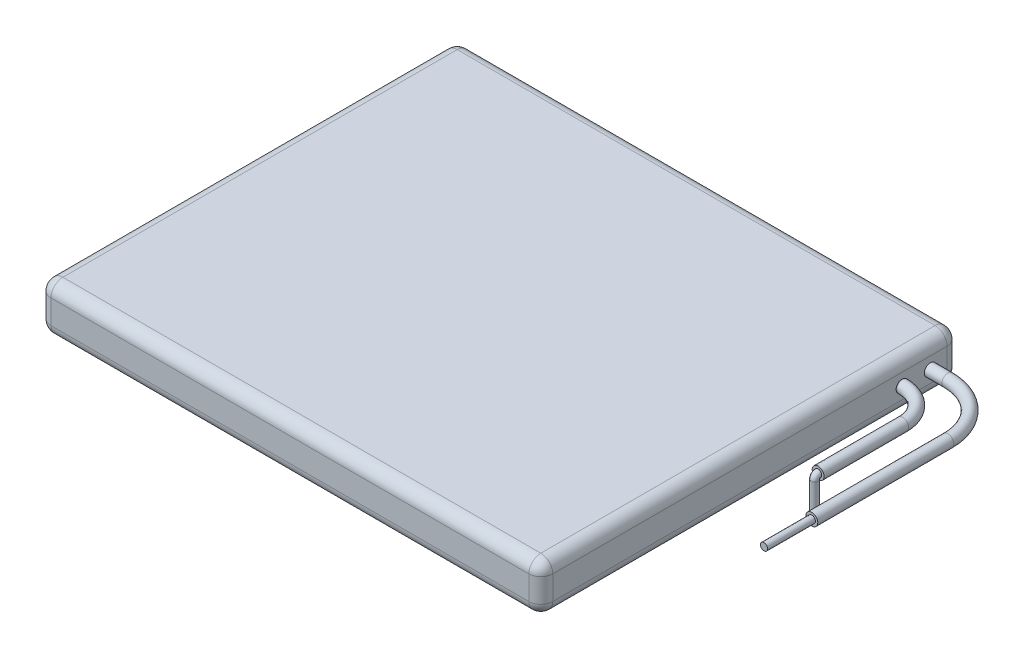
ISO-10303-21;
HEADER;
FILE_DESCRIPTION(('STEP AP214'),'2;1');
FILE_NAME('part.step','',(''),(''),'','','');
FILE_SCHEMA(('AUTOMOTIVE_DESIGN { 1 0 10303 214 1 1 1 1 }'));
ENDSEC;
DATA;
#1=APPLICATION_CONTEXT('core data for automotive mechanical design processes');
#2=APPLICATION_PROTOCOL_DEFINITION('international standard','automotive_design',2000,#1);
#3=PRODUCT_CONTEXT('',#1,'mechanical');
#4=PRODUCT('Part','Part','',(#3));
#5=PRODUCT_RELATED_PRODUCT_CATEGORY('part','',(#4));
#6=PRODUCT_DEFINITION_FORMATION('','',#4);
#7=PRODUCT_DEFINITION_CONTEXT('part definition',#1,'design');
#8=PRODUCT_DEFINITION('design','',#6,#7);
#9=PRODUCT_DEFINITION_SHAPE('','',#8);
#10=(LENGTH_UNIT() NAMED_UNIT(*) SI_UNIT(.MILLI.,.METRE.));
#11=(NAMED_UNIT(*) PLANE_ANGLE_UNIT() SI_UNIT($,.RADIAN.));
#12=(NAMED_UNIT(*) SI_UNIT($,.STERADIAN.) SOLID_ANGLE_UNIT());
#13=UNCERTAINTY_MEASURE_WITH_UNIT(LENGTH_MEASURE(1.E-05),#10,'distance_accuracy_value','');
#14=(GEOMETRIC_REPRESENTATION_CONTEXT(3) GLOBAL_UNCERTAINTY_ASSIGNED_CONTEXT((#13)) GLOBAL_UNIT_ASSIGNED_CONTEXT((#10,
#11,#12)) REPRESENTATION_CONTEXT('',''));
#15=CARTESIAN_POINT('',(0.,0.,0.));
#16=DIRECTION('',(0.,0.,1.));
#17=DIRECTION('',(1.,0.,0.));
#18=AXIS2_PLACEMENT_3D('',#15,#16,#17);
#19=CARTESIAN_POINT('',(0.,4.,0.));
#20=DIRECTION('',(-1.,0.,0.));
#21=DIRECTION('',(0.,0.,1.));
#22=AXIS2_PLACEMENT_3D('',#19,#20,#21);
#23=PLANE('',#22);
#24=DIRECTION('',(0.,-1.,0.));
#25=VECTOR('',#24,1.);
#26=CARTESIAN_POINT('',(2.42663032525213E-13,4.,-33.9999999999999));
#27=LINE('',#26,#25);
#28=CARTESIAN_POINT('',(2.42663032525213E-13,3.,-33.9999999999999));
#29=VERTEX_POINT('',#28);
#30=CARTESIAN_POINT('',(2.42663032525213E-13,1.,-33.9999999999999));
#31=VERTEX_POINT('',#30);
#32=EDGE_CURVE('E198',#29,#31,#27,.T.);
#33=ORIENTED_EDGE('',*,*,#32,.T.);
#34=DIRECTION('',(0.,0.,-1.));
#35=VECTOR('',#34,1.);
#36=CARTESIAN_POINT('',(0.,1.,0.));
#37=LINE('',#36,#35);
#38=CARTESIAN_POINT('',(0.,1.,-1.00000000000001));
#39=VERTEX_POINT('',#38);
#40=EDGE_CURVE('E217',#31,#39,#37,.F.);
#41=ORIENTED_EDGE('',*,*,#40,.T.);
#42=DIRECTION('',(0.,-1.,0.));
#43=VECTOR('',#42,1.);
#44=CARTESIAN_POINT('',(0.,4.,-1.00000000000001));
#45=LINE('',#44,#43);
#46=CARTESIAN_POINT('',(0.,3.,-1.00000000000001));
#47=VERTEX_POINT('',#46);
#48=EDGE_CURVE('E195',#39,#47,#45,.F.);
#49=ORIENTED_EDGE('',*,*,#48,.T.);
#50=DIRECTION('',(0.,0.,-1.));
#51=VECTOR('',#50,1.);
#52=CARTESIAN_POINT('',(2.42644446202256E-13,3.,-33.9999999999999));
#53=LINE('',#52,#51);
#54=EDGE_CURVE('E215',#47,#29,#53,.T.);
#55=ORIENTED_EDGE('',*,*,#54,.T.);
#56=EDGE_LOOP('',(#33,#41,#49,#55));
#57=FACE_BOUND('',#56,.T.);
#58=ADVANCED_FACE('F37',(#57),#23,.T.);
#59=CARTESIAN_POINT('',(0.,4.,0.));
#60=DIRECTION('',(0.,0.,-1.));
#61=DIRECTION('',(-1.,0.,0.));
#62=AXIS2_PLACEMENT_3D('',#59,#60,#61);
#63=PLANE('',#62);
#64=DIRECTION('',(0.,-1.,0.));
#65=VECTOR('',#64,1.);
#66=CARTESIAN_POINT('',(41.,4.,0.));
#67=LINE('',#66,#65);
#68=CARTESIAN_POINT('',(41.,1.,0.));
#69=VERTEX_POINT('',#68);
#70=CARTESIAN_POINT('',(41.,3.,0.));
#71=VERTEX_POINT('',#70);
#72=EDGE_CURVE('E186',#69,#71,#67,.F.);
#73=ORIENTED_EDGE('',*,*,#72,.T.);
#74=DIRECTION('',(1.,0.,0.));
#75=VECTOR('',#74,1.);
#76=CARTESIAN_POINT('',(0.,3.,0.));
#77=LINE('',#76,#75);
#78=CARTESIAN_POINT('',(1.00000000000001,3.,0.));
#79=VERTEX_POINT('',#78);
#80=EDGE_CURVE('E166',#71,#79,#77,.F.);
#81=ORIENTED_EDGE('',*,*,#80,.T.);
#82=DIRECTION('',(0.,-1.,0.));
#83=VECTOR('',#82,1.);
#84=CARTESIAN_POINT('',(1.00000000000001,0.,0.));
#85=LINE('',#84,#83);
#86=CARTESIAN_POINT('',(1.00000000000001,1.,0.));
#87=VERTEX_POINT('',#86);
#88=EDGE_CURVE('E183',#79,#87,#85,.T.);
#89=ORIENTED_EDGE('',*,*,#88,.T.);
#90=DIRECTION('',(1.,0.,0.));
#91=VECTOR('',#90,1.);
#92=CARTESIAN_POINT('',(41.,1.,0.));
#93=LINE('',#92,#91);
#94=EDGE_CURVE('E247',#87,#69,#93,.T.);
#95=ORIENTED_EDGE('',*,*,#94,.T.);
#96=EDGE_LOOP('',(#73,#81,#89,#95));
#97=FACE_BOUND('',#96,.T.);
#98=ADVANCED_FACE('F302',(#97),#63,.F.);
#99=CARTESIAN_POINT('',(42.,4.,0.));
#100=DIRECTION('',(-1.,0.,0.));
#101=DIRECTION('',(0.,0.,1.));
#102=AXIS2_PLACEMENT_3D('',#99,#100,#101);
#103=PLANE('',#102);
#104=CARTESIAN_POINT('',(42.,2.,-30.2378300408133));
#105=DIRECTION('',(1.,0.,0.));
#106=DIRECTION('',(0.,0.,-1.));
#107=AXIS2_PLACEMENT_3D('',#104,#105,#106);
#108=CIRCLE('',#107,0.499999999999999);
#109=CARTESIAN_POINT('',(42.,2.,-30.7378300408133));
#110=VERTEX_POINT('',#109);
#111=EDGE_CURVE('E150',#110,#110,#108,.T.);
#112=ORIENTED_EDGE('',*,*,#111,.F.);
#113=EDGE_LOOP('',(#112));
#114=FACE_BOUND('',#113,.T.);
#115=CARTESIAN_POINT('',(42.,2.,-32.5988341464532));
#116=DIRECTION('',(1.,0.,0.));
#117=DIRECTION('',(0.,0.,-1.));
#118=AXIS2_PLACEMENT_3D('',#115,#116,#117);
#119=CIRCLE('',#118,0.499999999999999);
#120=CARTESIAN_POINT('',(42.,2.,-33.0988341464532));
#121=VERTEX_POINT('',#120);
#122=EDGE_CURVE('E163',#121,#121,#119,.T.);
#123=ORIENTED_EDGE('',*,*,#122,.F.);
#124=EDGE_LOOP('',(#123));
#125=FACE_BOUND('',#124,.T.);
#126=DIRECTION('',(0.,-1.,0.));
#127=VECTOR('',#126,1.);
#128=CARTESIAN_POINT('',(42.,4.,-1.));
#129=LINE('',#128,#127);
#130=CARTESIAN_POINT('',(42.,3.,-1.));
#131=VERTEX_POINT('',#130);
#132=CARTESIAN_POINT('',(42.,1.,-1.));
#133=VERTEX_POINT('',#132);
#134=EDGE_CURVE('E179',#131,#133,#129,.T.);
#135=ORIENTED_EDGE('',*,*,#134,.T.);
#136=DIRECTION('',(0.,0.,-1.));
#137=VECTOR('',#136,1.);
#138=CARTESIAN_POINT('',(42.,1.,-34.));
#139=LINE('',#138,#137);
#140=CARTESIAN_POINT('',(42.,1.,-34.));
#141=VERTEX_POINT('',#140);
#142=EDGE_CURVE('E234',#133,#141,#139,.T.);
#143=ORIENTED_EDGE('',*,*,#142,.T.);
#144=DIRECTION('',(0.,-1.,0.));
#145=VECTOR('',#144,1.);
#146=CARTESIAN_POINT('',(42.,4.,-34.));
#147=LINE('',#146,#145);
#148=CARTESIAN_POINT('',(42.,3.,-34.));
#149=VERTEX_POINT('',#148);
#150=EDGE_CURVE('E176',#141,#149,#147,.F.);
#151=ORIENTED_EDGE('',*,*,#150,.T.);
#152=DIRECTION('',(0.,0.,-1.));
#153=VECTOR('',#152,1.);
#154=CARTESIAN_POINT('',(42.,3.,0.));
#155=LINE('',#154,#153);
#156=EDGE_CURVE('E232',#149,#131,#155,.F.);
#157=ORIENTED_EDGE('',*,*,#156,.T.);
#158=EDGE_LOOP('',(#135,#143,#151,#157));
#159=FACE_BOUND('',#158,.T.);
#160=ADVANCED_FACE('F334',(#114,#125,#159),#103,.F.);
#161=CARTESIAN_POINT('',(2.4980018054066E-13,4.,-34.9999999999999));
#162=DIRECTION('',(0.,0.,-1.));
#163=DIRECTION('',(-1.,0.,0.));
#164=AXIS2_PLACEMENT_3D('',#161,#162,#163);
#165=PLANE('',#164);
#166=DIRECTION('',(0.,-1.,0.));
#167=VECTOR('',#166,1.);
#168=CARTESIAN_POINT('',(41.,0.,-35.));
#169=LINE('',#168,#167);
#170=CARTESIAN_POINT('',(41.,3.,-35.));
#171=VERTEX_POINT('',#170);
#172=CARTESIAN_POINT('',(41.,1.,-35.));
#173=VERTEX_POINT('',#172);
#174=EDGE_CURVE('E192',#171,#173,#169,.T.);
#175=ORIENTED_EDGE('',*,*,#174,.T.);
#176=DIRECTION('',(1.,0.,0.));
#177=VECTOR('',#176,1.);
#178=CARTESIAN_POINT('',(2.4980018054066E-13,1.,-34.9999999999999));
#179=LINE('',#178,#177);
#180=CARTESIAN_POINT('',(1.00000000000024,1.,-34.9999999999999));
#181=VERTEX_POINT('',#180);
#182=EDGE_CURVE('E226',#173,#181,#179,.F.);
#183=ORIENTED_EDGE('',*,*,#182,.T.);
#184=DIRECTION('',(0.,-1.,0.));
#185=VECTOR('',#184,1.);
#186=CARTESIAN_POINT('',(1.00000000000024,4.,-34.9999999999999));
#187=LINE('',#186,#185);
#188=CARTESIAN_POINT('',(1.00000000000024,3.,-34.9999999999999));
#189=VERTEX_POINT('',#188);
#190=EDGE_CURVE('E189',#181,#189,#187,.F.);
#191=ORIENTED_EDGE('',*,*,#190,.T.);
#192=DIRECTION('',(1.,0.,0.));
#193=VECTOR('',#192,1.);
#194=CARTESIAN_POINT('',(41.,3.,-35.));
#195=LINE('',#194,#193);
#196=EDGE_CURVE('E224',#189,#171,#195,.T.);
#197=ORIENTED_EDGE('',*,*,#196,.T.);
#198=EDGE_LOOP('',(#175,#183,#191,#197));
#199=FACE_BOUND('',#198,.T.);
#200=ADVANCED_FACE('F352',(#199),#165,.T.);
#201=CARTESIAN_POINT('',(0.,4.,0.));
#202=DIRECTION('',(0.,-1.,0.));
#203=DIRECTION('',(0.,0.,-1.));
#204=AXIS2_PLACEMENT_3D('',#201,#202,#203);
#205=PLANE('',#204);
#206=DIRECTION('',(1.,0.,0.));
#207=VECTOR('',#206,1.);
#208=CARTESIAN_POINT('',(1.00000000000024,4.,-33.9999999999999));
#209=LINE('',#208,#207);
#210=CARTESIAN_POINT('',(41.,4.,-34.));
#211=VERTEX_POINT('',#210);
#212=CARTESIAN_POINT('',(1.00000000000024,4.,-33.9999999999999));
#213=VERTEX_POINT('',#212);
#214=EDGE_CURVE('E240',#211,#213,#209,.F.);
#215=ORIENTED_EDGE('',*,*,#214,.T.);
#216=DIRECTION('',(0.,0.,-1.));
#217=VECTOR('',#216,1.);
#218=CARTESIAN_POINT('',(1.00000000000001,4.,-1.));
#219=LINE('',#218,#217);
#220=CARTESIAN_POINT('',(1.00000000000001,4.,-1.));
#221=VERTEX_POINT('',#220);
#222=EDGE_CURVE('E245',#213,#221,#219,.F.);
#223=ORIENTED_EDGE('',*,*,#222,.T.);
#224=DIRECTION('',(1.,0.,0.));
#225=VECTOR('',#224,1.);
#226=CARTESIAN_POINT('',(0.,4.,-1.));
#227=LINE('',#226,#225);
#228=CARTESIAN_POINT('',(41.,4.,-1.));
#229=VERTEX_POINT('',#228);
#230=EDGE_CURVE('E62',#221,#229,#227,.T.);
#231=ORIENTED_EDGE('',*,*,#230,.T.);
#232=DIRECTION('',(0.,0.,-1.));
#233=VECTOR('',#232,1.);
#234=CARTESIAN_POINT('',(41.,4.,0.));
#235=LINE('',#234,#233);
#236=EDGE_CURVE('E242',#229,#211,#235,.T.);
#237=ORIENTED_EDGE('',*,*,#236,.T.);
#238=EDGE_LOOP('',(#215,#223,#231,#237));
#239=FACE_BOUND('',#238,.T.);
#240=ADVANCED_FACE('F701',(#239),#205,.F.);
#241=CARTESIAN_POINT('',(0.,0.,0.));
#242=DIRECTION('',(0.,-1.,0.));
#243=DIRECTION('',(0.,0.,-1.));
#244=AXIS2_PLACEMENT_3D('',#241,#242,#243);
#245=PLANE('',#244);
#246=DIRECTION('',(1.,0.,0.));
#247=VECTOR('',#246,1.);
#248=CARTESIAN_POINT('',(1.00000000000001,0.,-1.));
#249=LINE('',#248,#247);
#250=CARTESIAN_POINT('',(41.,0.,-1.));
#251=VERTEX_POINT('',#250);
#252=CARTESIAN_POINT('',(1.00000000000001,0.,-1.));
#253=VERTEX_POINT('',#252);
#254=EDGE_CURVE('E206',#251,#253,#249,.F.);
#255=ORIENTED_EDGE('',*,*,#254,.T.);
#256=DIRECTION('',(0.,0.,-1.));
#257=VECTOR('',#256,1.);
#258=CARTESIAN_POINT('',(1.,0.,0.));
#259=LINE('',#258,#257);
#260=CARTESIAN_POINT('',(1.00000000000024,0.,-33.9999999999999));
#261=VERTEX_POINT('',#260);
#262=EDGE_CURVE('E212',#253,#261,#259,.T.);
#263=ORIENTED_EDGE('',*,*,#262,.T.);
#264=DIRECTION('',(1.,0.,0.));
#265=VECTOR('',#264,1.);
#266=CARTESIAN_POINT('',(0.,0.,-33.9999999999999));
#267=LINE('',#266,#265);
#268=CARTESIAN_POINT('',(41.,0.,-34.));
#269=VERTEX_POINT('',#268);
#270=EDGE_CURVE('E210',#261,#269,#267,.T.);
#271=ORIENTED_EDGE('',*,*,#270,.T.);
#272=DIRECTION('',(0.,0.,-1.));
#273=VECTOR('',#272,1.);
#274=CARTESIAN_POINT('',(41.,0.,-1.));
#275=LINE('',#274,#273);
#276=EDGE_CURVE('E208',#269,#251,#275,.F.);
#277=ORIENTED_EDGE('',*,*,#276,.T.);
#278=EDGE_LOOP('',(#255,#263,#271,#277));
#279=FACE_BOUND('',#278,.T.);
#280=ADVANCED_FACE('F324',(#279),#245,.T.);
#281=CARTESIAN_POINT('',(41.,4.,-1.));
#282=DIRECTION('',(0.,-1.,0.));
#283=DIRECTION('',(0.,0.,-1.));
#284=AXIS2_PLACEMENT_3D('',#281,#282,#283);
#285=CYLINDRICAL_SURFACE('',#284,1.);
#286=ORIENTED_EDGE('',*,*,#72,.F.);
#287=CARTESIAN_POINT('',(41.,1.,-1.));
#288=DIRECTION('',(0.,-1.,0.));
#289=DIRECTION('',(0.,0.,-1.));
#290=AXIS2_PLACEMENT_3D('',#287,#288,#289);
#291=CIRCLE('',#290,1.);
#292=EDGE_CURVE('E238',#69,#133,#291,.F.);
#293=ORIENTED_EDGE('',*,*,#292,.T.);
#294=ORIENTED_EDGE('',*,*,#134,.F.);
#295=CARTESIAN_POINT('',(41.,3.,-1.));
#296=DIRECTION('',(0.,-1.,0.));
#297=DIRECTION('',(0.,0.,-1.));
#298=AXIS2_PLACEMENT_3D('',#295,#296,#297);
#299=CIRCLE('',#298,1.);
#300=EDGE_CURVE('E236',#131,#71,#299,.T.);
#301=ORIENTED_EDGE('',*,*,#300,.T.);
#302=EDGE_LOOP('',(#286,#293,#294,#301));
#303=FACE_BOUND('',#302,.T.);
#304=ADVANCED_FACE('F299',(#303),#285,.T.);
#305=CARTESIAN_POINT('',(41.,4.,-34.));
#306=DIRECTION('',(0.,1.,0.));
#307=DIRECTION('',(0.,0.,1.));
#308=AXIS2_PLACEMENT_3D('',#305,#306,#307);
#309=CYLINDRICAL_SURFACE('',#308,1.);
#310=ORIENTED_EDGE('',*,*,#150,.F.);
#311=CARTESIAN_POINT('',(41.,1.,-34.));
#312=DIRECTION('',(0.,1.,0.));
#313=DIRECTION('',(0.,0.,1.));
#314=AXIS2_PLACEMENT_3D('',#311,#312,#313);
#315=CIRCLE('',#314,1.);
#316=EDGE_CURVE('E230',#141,#173,#315,.T.);
#317=ORIENTED_EDGE('',*,*,#316,.T.);
#318=ORIENTED_EDGE('',*,*,#174,.F.);
#319=CARTESIAN_POINT('',(41.,3.,-34.));
#320=DIRECTION('',(0.,1.,0.));
#321=DIRECTION('',(0.,0.,1.));
#322=AXIS2_PLACEMENT_3D('',#319,#320,#321);
#323=CIRCLE('',#322,1.);
#324=EDGE_CURVE('E228',#171,#149,#323,.F.);
#325=ORIENTED_EDGE('',*,*,#324,.T.);
#326=EDGE_LOOP('',(#310,#317,#318,#325));
#327=FACE_BOUND('',#326,.T.);
#328=ADVANCED_FACE('F338',(#327),#309,.T.);
#329=CARTESIAN_POINT('',(1.00000000000024,4.,-33.9999999999999));
#330=DIRECTION('',(0.,-1.,0.));
#331=DIRECTION('',(0.,0.,-1.));
#332=AXIS2_PLACEMENT_3D('',#329,#330,#331);
#333=CYLINDRICAL_SURFACE('',#332,1.);
#334=ORIENTED_EDGE('',*,*,#190,.F.);
#335=CARTESIAN_POINT('',(1.00000000000024,1.,-33.9999999999999));
#336=DIRECTION('',(0.,-1.,0.));
#337=DIRECTION('',(0.,0.,-1.));
#338=AXIS2_PLACEMENT_3D('',#335,#336,#337);
#339=CIRCLE('',#338,1.);
#340=EDGE_CURVE('E222',#181,#31,#339,.F.);
#341=ORIENTED_EDGE('',*,*,#340,.T.);
#342=ORIENTED_EDGE('',*,*,#32,.F.);
#343=CARTESIAN_POINT('',(1.00000000000024,3.,-33.9999999999999));
#344=DIRECTION('',(0.,-1.,0.));
#345=DIRECTION('',(0.,0.,-1.));
#346=AXIS2_PLACEMENT_3D('',#343,#344,#345);
#347=CIRCLE('',#346,1.);
#348=EDGE_CURVE('E219',#29,#189,#347,.T.);
#349=ORIENTED_EDGE('',*,*,#348,.T.);
#350=EDGE_LOOP('',(#334,#341,#342,#349));
#351=FACE_BOUND('',#350,.T.);
#352=ADVANCED_FACE('F354',(#351),#333,.T.);
#353=CARTESIAN_POINT('',(1.00000000000001,4.,-1.));
#354=DIRECTION('',(0.,1.,0.));
#355=DIRECTION('',(0.,0.,1.));
#356=AXIS2_PLACEMENT_3D('',#353,#354,#355);
#357=CYLINDRICAL_SURFACE('',#356,1.);
#358=ORIENTED_EDGE('',*,*,#48,.F.);
#359=CARTESIAN_POINT('',(1.00000000000001,1.,-1.));
#360=DIRECTION('',(0.,1.,0.));
#361=DIRECTION('',(0.,0.,1.));
#362=AXIS2_PLACEMENT_3D('',#359,#360,#361);
#363=CIRCLE('',#362,1.);
#364=EDGE_CURVE('E203',#39,#87,#363,.T.);
#365=ORIENTED_EDGE('',*,*,#364,.T.);
#366=ORIENTED_EDGE('',*,*,#88,.F.);
#367=CARTESIAN_POINT('',(1.00000000000001,3.,-1.));
#368=DIRECTION('',(0.,1.,0.));
#369=DIRECTION('',(0.,0.,1.));
#370=AXIS2_PLACEMENT_3D('',#367,#368,#369);
#371=CIRCLE('',#370,1.);
#372=EDGE_CURVE('E201',#79,#47,#371,.F.);
#373=ORIENTED_EDGE('',*,*,#372,.T.);
#374=EDGE_LOOP('',(#358,#365,#366,#373));
#375=FACE_BOUND('',#374,.T.);
#376=ADVANCED_FACE('F313',(#375),#357,.T.);
#377=CARTESIAN_POINT('',(41.,1.,-34.));
#378=DIRECTION('',(0.,-1.,0.));
#379=DIRECTION('',(0.,0.,-1.));
#380=AXIS2_PLACEMENT_3D('',#377,#378,#379);
#381=SPHERICAL_SURFACE('',#380,1.);
#382=CARTESIAN_POINT('',(41.,1.,-34.));
#383=DIRECTION('',(-1.,0.,0.));
#384=DIRECTION('',(0.,0.,1.));
#385=AXIS2_PLACEMENT_3D('',#382,#383,#384);
#386=CIRCLE('',#385,1.);
#387=EDGE_CURVE('E266',#173,#269,#386,.T.);
#388=ORIENTED_EDGE('',*,*,#387,.F.);
#389=ORIENTED_EDGE('',*,*,#316,.F.);
#390=CARTESIAN_POINT('',(41.,1.,-34.));
#391=DIRECTION('',(0.,0.,1.));
#392=DIRECTION('',(1.,0.,0.));
#393=AXIS2_PLACEMENT_3D('',#390,#391,#392);
#394=CIRCLE('',#393,1.);
#395=EDGE_CURVE('E180',#269,#141,#394,.T.);
#396=ORIENTED_EDGE('',*,*,#395,.F.);
#397=EDGE_LOOP('',(#388,#389,#396));
#398=FACE_BOUND('',#397,.T.);
#399=ADVANCED_FACE('F344',(#398),#381,.T.);
#400=CARTESIAN_POINT('',(41.,1.,0.));
#401=DIRECTION('',(0.,0.,1.));
#402=DIRECTION('',(1.,0.,0.));
#403=AXIS2_PLACEMENT_3D('',#400,#401,#402);
#404=CYLINDRICAL_SURFACE('',#403,1.);
#405=ORIENTED_EDGE('',*,*,#395,.T.);
#406=ORIENTED_EDGE('',*,*,#142,.F.);
#407=CARTESIAN_POINT('',(41.,1.,-1.));
#408=DIRECTION('',(0.,0.,1.));
#409=DIRECTION('',(1.,0.,0.));
#410=AXIS2_PLACEMENT_3D('',#407,#408,#409);
#411=CIRCLE('',#410,1.);
#412=EDGE_CURVE('E263',#251,#133,#411,.T.);
#413=ORIENTED_EDGE('',*,*,#412,.F.);
#414=ORIENTED_EDGE('',*,*,#276,.F.);
#415=EDGE_LOOP('',(#405,#406,#413,#414));
#416=FACE_BOUND('',#415,.T.);
#417=ADVANCED_FACE('F330',(#416),#404,.T.);
#418=CARTESIAN_POINT('',(0.,1.,-33.9999999999999));
#419=DIRECTION('',(1.,0.,0.));
#420=DIRECTION('',(0.,0.,-1.));
#421=AXIS2_PLACEMENT_3D('',#418,#419,#420);
#422=CYLINDRICAL_SURFACE('',#421,1.);
#423=ORIENTED_EDGE('',*,*,#387,.T.);
#424=ORIENTED_EDGE('',*,*,#270,.F.);
#425=CARTESIAN_POINT('',(1.00000000000024,1.,-33.9999999999999));
#426=DIRECTION('',(-1.,0.,0.));
#427=DIRECTION('',(0.,0.,1.));
#428=AXIS2_PLACEMENT_3D('',#425,#426,#427);
#429=CIRCLE('',#428,1.);
#430=EDGE_CURVE('E260',#181,#261,#429,.T.);
#431=ORIENTED_EDGE('',*,*,#430,.F.);
#432=ORIENTED_EDGE('',*,*,#182,.F.);
#433=EDGE_LOOP('',(#423,#424,#431,#432));
#434=FACE_BOUND('',#433,.T.);
#435=ADVANCED_FACE('F348',(#434),#422,.T.);
#436=CARTESIAN_POINT('',(41.,1.,-1.));
#437=DIRECTION('',(0.,-1.,0.));
#438=DIRECTION('',(0.,0.,-1.));
#439=AXIS2_PLACEMENT_3D('',#436,#437,#438);
#440=SPHERICAL_SURFACE('',#439,1.);
#441=ORIENTED_EDGE('',*,*,#412,.T.);
#442=ORIENTED_EDGE('',*,*,#292,.F.);
#443=CARTESIAN_POINT('',(41.,1.,-1.));
#444=DIRECTION('',(-1.,0.,0.));
#445=DIRECTION('',(0.,0.,1.));
#446=AXIS2_PLACEMENT_3D('',#443,#444,#445);
#447=CIRCLE('',#446,1.);
#448=EDGE_CURVE('E257',#251,#69,#447,.T.);
#449=ORIENTED_EDGE('',*,*,#448,.F.);
#450=EDGE_LOOP('',(#441,#442,#449));
#451=FACE_BOUND('',#450,.T.);
#452=ADVANCED_FACE('F332',(#451),#440,.T.);
#453=CARTESIAN_POINT('',(1.00000000000024,1.,-33.9999999999999));
#454=DIRECTION('',(0.,-1.,0.));
#455=DIRECTION('',(0.,0.,-1.));
#456=AXIS2_PLACEMENT_3D('',#453,#454,#455);
#457=SPHERICAL_SURFACE('',#456,1.);
#458=ORIENTED_EDGE('',*,*,#340,.F.);
#459=ORIENTED_EDGE('',*,*,#430,.T.);
#460=CARTESIAN_POINT('',(1.00000000000024,1.,-33.9999999999999));
#461=DIRECTION('',(0.,0.,1.));
#462=DIRECTION('',(1.,0.,0.));
#463=AXIS2_PLACEMENT_3D('',#460,#461,#462);
#464=CIRCLE('',#463,1.);
#465=EDGE_CURVE('E255',#31,#261,#464,.T.);
#466=ORIENTED_EDGE('',*,*,#465,.F.);
#467=EDGE_LOOP('',(#458,#459,#466));
#468=FACE_BOUND('',#467,.T.);
#469=ADVANCED_FACE('F404',(#468),#457,.T.);
#470=CARTESIAN_POINT('',(0.,1.,-1.));
#471=DIRECTION('',(-1.,0.,0.));
#472=DIRECTION('',(0.,0.,1.));
#473=AXIS2_PLACEMENT_3D('',#470,#471,#472);
#474=CYLINDRICAL_SURFACE('',#473,1.);
#475=ORIENTED_EDGE('',*,*,#448,.T.);
#476=ORIENTED_EDGE('',*,*,#94,.F.);
#477=CARTESIAN_POINT('',(1.00000000000001,1.,-1.));
#478=DIRECTION('',(-1.,0.,0.));
#479=DIRECTION('',(0.,0.,1.));
#480=AXIS2_PLACEMENT_3D('',#477,#478,#479);
#481=CIRCLE('',#480,1.);
#482=EDGE_CURVE('E253',#253,#87,#481,.T.);
#483=ORIENTED_EDGE('',*,*,#482,.F.);
#484=ORIENTED_EDGE('',*,*,#254,.F.);
#485=EDGE_LOOP('',(#475,#476,#483,#484));
#486=FACE_BOUND('',#485,.T.);
#487=ADVANCED_FACE('F307',(#486),#474,.T.);
#488=CARTESIAN_POINT('',(1.,1.,0.));
#489=DIRECTION('',(0.,0.,-1.));
#490=DIRECTION('',(-1.,0.,0.));
#491=AXIS2_PLACEMENT_3D('',#488,#489,#490);
#492=CYLINDRICAL_SURFACE('',#491,1.);
#493=ORIENTED_EDGE('',*,*,#465,.T.);
#494=ORIENTED_EDGE('',*,*,#262,.F.);
#495=CARTESIAN_POINT('',(1.00000000000001,1.,-1.));
#496=DIRECTION('',(0.,0.,1.));
#497=DIRECTION('',(1.,0.,0.));
#498=AXIS2_PLACEMENT_3D('',#495,#496,#497);
#499=CIRCLE('',#498,1.);
#500=EDGE_CURVE('E250',#39,#253,#499,.T.);
#501=ORIENTED_EDGE('',*,*,#500,.F.);
#502=ORIENTED_EDGE('',*,*,#40,.F.);
#503=EDGE_LOOP('',(#493,#494,#501,#502));
#504=FACE_BOUND('',#503,.T.);
#505=ADVANCED_FACE('F321',(#504),#492,.T.);
#506=CARTESIAN_POINT('',(1.00000000000001,1.,-1.));
#507=DIRECTION('',(0.,-1.,0.));
#508=DIRECTION('',(0.,0.,-1.));
#509=AXIS2_PLACEMENT_3D('',#506,#507,#508);
#510=SPHERICAL_SURFACE('',#509,1.);
#511=ORIENTED_EDGE('',*,*,#482,.T.);
#512=ORIENTED_EDGE('',*,*,#364,.F.);
#513=ORIENTED_EDGE('',*,*,#500,.T.);
#514=EDGE_LOOP('',(#511,#512,#513));
#515=FACE_BOUND('',#514,.T.);
#516=ADVANCED_FACE('F317',(#515),#510,.T.);
#517=CARTESIAN_POINT('',(41.,3.,-1.));
#518=DIRECTION('',(0.,-1.,0.));
#519=DIRECTION('',(0.,0.,-1.));
#520=AXIS2_PLACEMENT_3D('',#517,#518,#519);
#521=SPHERICAL_SURFACE('',#520,1.);
#522=CARTESIAN_POINT('',(41.,3.,-1.));
#523=DIRECTION('',(-1.,0.,0.));
#524=DIRECTION('',(0.,0.,1.));
#525=AXIS2_PLACEMENT_3D('',#522,#523,#524);
#526=CIRCLE('',#525,1.);
#527=EDGE_CURVE('E283',#71,#229,#526,.T.);
#528=ORIENTED_EDGE('',*,*,#527,.F.);
#529=ORIENTED_EDGE('',*,*,#300,.F.);
#530=CARTESIAN_POINT('',(41.,3.,-1.));
#531=DIRECTION('',(0.,0.,-1.));
#532=DIRECTION('',(-1.,0.,0.));
#533=AXIS2_PLACEMENT_3D('',#530,#531,#532);
#534=CIRCLE('',#533,1.);
#535=EDGE_CURVE('E41',#229,#131,#534,.T.);
#536=ORIENTED_EDGE('',*,*,#535,.F.);
#537=EDGE_LOOP('',(#528,#529,#536));
#538=FACE_BOUND('',#537,.T.);
#539=ADVANCED_FACE('F39',(#538),#521,.T.);
#540=CARTESIAN_POINT('',(41.,3.,0.));
#541=DIRECTION('',(0.,0.,-1.));
#542=DIRECTION('',(-1.,0.,0.));
#543=AXIS2_PLACEMENT_3D('',#540,#541,#542);
#544=CYLINDRICAL_SURFACE('',#543,1.);
#545=ORIENTED_EDGE('',*,*,#535,.T.);
#546=ORIENTED_EDGE('',*,*,#156,.F.);
#547=CARTESIAN_POINT('',(41.,3.,-34.));
#548=DIRECTION('',(0.,0.,-1.));
#549=DIRECTION('',(-1.,0.,0.));
#550=AXIS2_PLACEMENT_3D('',#547,#548,#549);
#551=CIRCLE('',#550,1.);
#552=EDGE_CURVE('E281',#211,#149,#551,.T.);
#553=ORIENTED_EDGE('',*,*,#552,.F.);
#554=ORIENTED_EDGE('',*,*,#236,.F.);
#555=EDGE_LOOP('',(#545,#546,#553,#554));
#556=FACE_BOUND('',#555,.T.);
#557=ADVANCED_FACE('F292',(#556),#544,.T.);
#558=CARTESIAN_POINT('',(0.,3.,-1.));
#559=DIRECTION('',(1.,0.,0.));
#560=DIRECTION('',(0.,0.,-1.));
#561=AXIS2_PLACEMENT_3D('',#558,#559,#560);
#562=CYLINDRICAL_SURFACE('',#561,1.);
#563=ORIENTED_EDGE('',*,*,#527,.T.);
#564=ORIENTED_EDGE('',*,*,#230,.F.);
#565=CARTESIAN_POINT('',(1.00000000000001,3.,-1.));
#566=DIRECTION('',(-1.,0.,0.));
#567=DIRECTION('',(0.,0.,1.));
#568=AXIS2_PLACEMENT_3D('',#565,#566,#567);
#569=CIRCLE('',#568,1.);
#570=EDGE_CURVE('E279',#79,#221,#569,.T.);
#571=ORIENTED_EDGE('',*,*,#570,.F.);
#572=ORIENTED_EDGE('',*,*,#80,.F.);
#573=EDGE_LOOP('',(#563,#564,#571,#572));
#574=FACE_BOUND('',#573,.T.);
#575=ADVANCED_FACE('F371',(#574),#562,.T.);
#576=CARTESIAN_POINT('',(41.,3.,-34.));
#577=DIRECTION('',(0.,-1.,0.));
#578=DIRECTION('',(0.,0.,-1.));
#579=AXIS2_PLACEMENT_3D('',#576,#577,#578);
#580=SPHERICAL_SURFACE('',#579,1.);
#581=ORIENTED_EDGE('',*,*,#552,.T.);
#582=ORIENTED_EDGE('',*,*,#324,.F.);
#583=CARTESIAN_POINT('',(41.,3.,-34.));
#584=DIRECTION('',(-1.,0.,0.));
#585=DIRECTION('',(0.,0.,1.));
#586=AXIS2_PLACEMENT_3D('',#583,#584,#585);
#587=CIRCLE('',#586,1.);
#588=EDGE_CURVE('E276',#211,#171,#587,.T.);
#589=ORIENTED_EDGE('',*,*,#588,.F.);
#590=EDGE_LOOP('',(#581,#582,#589));
#591=FACE_BOUND('',#590,.T.);
#592=ADVANCED_FACE('F368',(#591),#580,.T.);
#593=CARTESIAN_POINT('',(1.00000000000001,3.,-1.));
#594=DIRECTION('',(0.,-1.,0.));
#595=DIRECTION('',(0.,0.,-1.));
#596=AXIS2_PLACEMENT_3D('',#593,#594,#595);
#597=SPHERICAL_SURFACE('',#596,1.);
#598=ORIENTED_EDGE('',*,*,#372,.F.);
#599=ORIENTED_EDGE('',*,*,#570,.T.);
#600=CARTESIAN_POINT('',(1.00000000000001,3.,-1.));
#601=DIRECTION('',(0.,0.,-1.));
#602=DIRECTION('',(-1.,0.,0.));
#603=AXIS2_PLACEMENT_3D('',#600,#601,#602);
#604=CIRCLE('',#603,1.);
#605=EDGE_CURVE('E54',#47,#221,#604,.T.);
#606=ORIENTED_EDGE('',*,*,#605,.F.);
#607=EDGE_LOOP('',(#598,#599,#606));
#608=FACE_BOUND('',#607,.T.);
#609=ADVANCED_FACE('F370',(#608),#597,.T.);
#610=CARTESIAN_POINT('',(2.51782721656062E-13,3.,-33.9999999999999));
#611=DIRECTION('',(-1.,0.,0.));
#612=DIRECTION('',(0.,0.,1.));
#613=AXIS2_PLACEMENT_3D('',#610,#611,#612);
#614=CYLINDRICAL_SURFACE('',#613,1.);
#615=ORIENTED_EDGE('',*,*,#588,.T.);
#616=ORIENTED_EDGE('',*,*,#196,.F.);
#617=CARTESIAN_POINT('',(1.00000000000024,3.,-33.9999999999999));
#618=DIRECTION('',(-1.,0.,0.));
#619=DIRECTION('',(0.,0.,1.));
#620=AXIS2_PLACEMENT_3D('',#617,#618,#619);
#621=CIRCLE('',#620,1.);
#622=EDGE_CURVE('E273',#213,#189,#621,.T.);
#623=ORIENTED_EDGE('',*,*,#622,.F.);
#624=ORIENTED_EDGE('',*,*,#214,.F.);
#625=EDGE_LOOP('',(#615,#616,#623,#624));
#626=FACE_BOUND('',#625,.T.);
#627=ADVANCED_FACE('F365',(#626),#614,.T.);
#628=CARTESIAN_POINT('',(1.,3.,0.));
#629=DIRECTION('',(0.,0.,1.));
#630=DIRECTION('',(1.,0.,0.));
#631=AXIS2_PLACEMENT_3D('',#628,#629,#630);
#632=CYLINDRICAL_SURFACE('',#631,1.);
#633=ORIENTED_EDGE('',*,*,#605,.T.);
#634=ORIENTED_EDGE('',*,*,#222,.F.);
#635=CARTESIAN_POINT('',(1.00000000000024,3.,-33.9999999999999));
#636=DIRECTION('',(0.,0.,-1.));
#637=DIRECTION('',(-1.,0.,0.));
#638=AXIS2_PLACEMENT_3D('',#635,#636,#637);
#639=CIRCLE('',#638,1.);
#640=EDGE_CURVE('E175',#29,#213,#639,.T.);
#641=ORIENTED_EDGE('',*,*,#640,.F.);
#642=ORIENTED_EDGE('',*,*,#54,.F.);
#643=EDGE_LOOP('',(#633,#634,#641,#642));
#644=FACE_BOUND('',#643,.T.);
#645=ADVANCED_FACE('F362',(#644),#632,.T.);
#646=CARTESIAN_POINT('',(1.00000000000024,3.,-33.9999999999999));
#647=DIRECTION('',(0.,-1.,0.));
#648=DIRECTION('',(0.,0.,-1.));
#649=AXIS2_PLACEMENT_3D('',#646,#647,#648);
#650=SPHERICAL_SURFACE('',#649,1.);
#651=ORIENTED_EDGE('',*,*,#622,.T.);
#652=ORIENTED_EDGE('',*,*,#348,.F.);
#653=ORIENTED_EDGE('',*,*,#640,.T.);
#654=EDGE_LOOP('',(#651,#652,#653));
#655=FACE_BOUND('',#654,.T.);
#656=ADVANCED_FACE('F359',(#655),#650,.T.);
#657=CARTESIAN_POINT('',(47.8742166026691,2.,-16.8057373512895));
#658=DIRECTION('',(0.,0.,1.));
#659=DIRECTION('',(1.,0.,0.));
#660=AXIS2_PLACEMENT_3D('',#657,#658,#659);
#661=PLANE('',#660);
#662=CARTESIAN_POINT('',(47.8742166026691,2.,-16.8057373512894));
#663=DIRECTION('',(0.,0.,1.));
#664=DIRECTION('',(1.,0.,0.));
#665=AXIS2_PLACEMENT_3D('',#662,#663,#664);
#666=CIRCLE('',#665,0.300000000000003);
#667=CARTESIAN_POINT('',(48.1742166026691,2.,-16.8057373512894));
#668=VERTEX_POINT('',#667);
#669=EDGE_CURVE('E11',#668,#668,#666,.T.);
#670=ORIENTED_EDGE('',*,*,#669,.F.);
#671=EDGE_LOOP('',(#670));
#672=FACE_BOUND('',#671,.T.);
#673=CARTESIAN_POINT('',(47.8742166026691,2.,-16.8057373512895));
#674=DIRECTION('',(0.,0.,1.));
#675=DIRECTION('',(1.,0.,0.));
#676=AXIS2_PLACEMENT_3D('',#673,#674,#675);
#677=CIRCLE('',#676,0.499999999999999);
#678=CARTESIAN_POINT('',(48.3742166026691,2.,-16.8057373512895));
#679=VERTEX_POINT('',#678);
#680=EDGE_CURVE('E172',#679,#679,#677,.T.);
#681=ORIENTED_EDGE('',*,*,#680,.T.);
#682=EDGE_LOOP('',(#681));
#683=FACE_BOUND('',#682,.T.);
#684=ADVANCED_FACE('F418',(#672,#683),#661,.T.);
#685=CARTESIAN_POINT('',(42.,2.,-32.5988341464532));
#686=DIRECTION('',(1.,0.,0.));
#687=DIRECTION('',(0.,0.,-1.));
#688=AXIS2_PLACEMENT_3D('',#685,#686,#687);
#689=CYLINDRICAL_SURFACE('',#688,0.499999999999999);
#690=CARTESIAN_POINT('',(43.4720110266329,2.,-32.5988341464532));
#691=DIRECTION('',(1.,0.,0.));
#692=DIRECTION('',(0.,0.,-1.));
#693=AXIS2_PLACEMENT_3D('',#690,#691,#692);
#694=CIRCLE('',#693,0.499999999999999);
#695=CARTESIAN_POINT('',(43.4720110266329,2.,-33.0988341464532));
#696=VERTEX_POINT('',#695);
#697=EDGE_CURVE('E162',#696,#696,#694,.T.);
#698=ORIENTED_EDGE('',*,*,#697,.F.);
#699=EDGE_LOOP('',(#698));
#700=FACE_BOUND('',#699,.T.);
#701=ORIENTED_EDGE('',*,*,#122,.T.);
#702=EDGE_LOOP('',(#701));
#703=FACE_BOUND('',#702,.T.);
#704=ADVANCED_FACE('F442',(#700,#703),#689,.T.);
#705=CARTESIAN_POINT('',(43.4720110266329,2.,-28.196628570417));
#706=DIRECTION('',(0.,-1.,0.));
#707=DIRECTION('',(0.,0.,-1.));
#708=AXIS2_PLACEMENT_3D('',#705,#706,#707);
#709=TOROIDAL_SURFACE('',#708,4.4022055760362,0.499999999999999);
#710=CARTESIAN_POINT('',(47.8742166026691,2.,-28.196628570417));
#711=DIRECTION('',(0.,0.,1.));
#712=DIRECTION('',(1.,0.,0.));
#713=AXIS2_PLACEMENT_3D('',#710,#711,#712);
#714=CIRCLE('',#713,0.499999999999999);
#715=CARTESIAN_POINT('',(48.3742166026691,2.,-28.196628570417));
#716=VERTEX_POINT('',#715);
#717=EDGE_CURVE('E169',#716,#716,#714,.T.);
#718=CARTESIAN_POINT('',(43.4720110266329,2.,-28.196628570417));
#719=DIRECTION('',(0.,-1.,0.));
#720=DIRECTION('',(0.,0.,-1.));
#721=AXIS2_PLACEMENT_3D('',#718,#719,#720);
#722=CIRCLE('',#721,4.9022055760362);
#723=EDGE_CURVE('',#696,#716,#722,.T.);
#724=ORIENTED_EDGE('',*,*,#697,.T.);
#725=ORIENTED_EDGE('',*,*,#717,.F.);
#726=ORIENTED_EDGE('',*,*,#723,.T.);
#727=ORIENTED_EDGE('',*,*,#723,.F.);
#728=EDGE_LOOP('',(#724,#726,#725,#727));
#729=FACE_BOUND('',#728,.T.);
#730=ADVANCED_FACE('F452',(#729),#709,.T.);
#731=CARTESIAN_POINT('',(47.8742166026691,2.,-28.196628570417));
#732=DIRECTION('',(0.,0.,1.));
#733=DIRECTION('',(1.,0.,0.));
#734=AXIS2_PLACEMENT_3D('',#731,#732,#733);
#735=CYLINDRICAL_SURFACE('',#734,0.499999999999999);
#736=ORIENTED_EDGE('',*,*,#680,.F.);
#737=EDGE_LOOP('',(#736));
#738=FACE_BOUND('',#737,.T.);
#739=ORIENTED_EDGE('',*,*,#717,.T.);
#740=EDGE_LOOP('',(#739));
#741=FACE_BOUND('',#740,.T.);
#742=ADVANCED_FACE('F419',(#738,#741),#735,.T.);
#743=CARTESIAN_POINT('',(44.794982778538,2.,-20.4154677161522));
#744=DIRECTION('',(0.,0.,1.));
#745=DIRECTION('',(1.,0.,0.));
#746=AXIS2_PLACEMENT_3D('',#743,#744,#745);
#747=PLANE('',#746);
#748=CARTESIAN_POINT('',(44.794982778538,2.,-20.4154677161521));
#749=DIRECTION('',(0.,0.,1.));
#750=DIRECTION('',(1.,0.,0.));
#751=AXIS2_PLACEMENT_3D('',#748,#749,#750);
#752=CIRCLE('',#751,0.300000000000003);
#753=CARTESIAN_POINT('',(45.094982778538,2.,-20.4154677161521));
#754=VERTEX_POINT('',#753);
#755=EDGE_CURVE('E46',#754,#754,#752,.T.);
#756=ORIENTED_EDGE('',*,*,#755,.F.);
#757=EDGE_LOOP('',(#756));
#758=FACE_BOUND('',#757,.T.);
#759=CARTESIAN_POINT('',(44.794982778538,2.,-20.4154677161522));
#760=DIRECTION('',(0.,0.,1.));
#761=DIRECTION('',(1.,0.,0.));
#762=AXIS2_PLACEMENT_3D('',#759,#760,#761);
#763=CIRCLE('',#762,0.499999999999999);
#764=CARTESIAN_POINT('',(45.294982778538,2.,-20.4154677161522));
#765=VERTEX_POINT('',#764);
#766=EDGE_CURVE('E159',#765,#765,#763,.T.);
#767=ORIENTED_EDGE('',*,*,#766,.T.);
#768=EDGE_LOOP('',(#767));
#769=FACE_BOUND('',#768,.T.);
#770=ADVANCED_FACE('F466',(#758,#769),#747,.T.);
#771=CARTESIAN_POINT('',(42.,2.,-30.2378300408133));
#772=DIRECTION('',(1.,0.,0.));
#773=DIRECTION('',(0.,0.,-1.));
#774=AXIS2_PLACEMENT_3D('',#771,#772,#773);
#775=CYLINDRICAL_SURFACE('',#774,0.499999999999999);
#776=CARTESIAN_POINT('',(42.0539677578776,2.,-30.2378300408133));
#777=DIRECTION('',(1.,0.,0.));
#778=DIRECTION('',(0.,0.,-1.));
#779=AXIS2_PLACEMENT_3D('',#776,#777,#778);
#780=CIRCLE('',#779,0.499999999999999);
#781=CARTESIAN_POINT('',(42.0539677578776,2.,-30.7378300408133));
#782=VERTEX_POINT('',#781);
#783=EDGE_CURVE('E153',#782,#782,#780,.T.);
#784=ORIENTED_EDGE('',*,*,#783,.F.);
#785=EDGE_LOOP('',(#784));
#786=FACE_BOUND('',#785,.T.);
#787=ORIENTED_EDGE('',*,*,#111,.T.);
#788=EDGE_LOOP('',(#787));
#789=FACE_BOUND('',#788,.T.);
#790=ADVANCED_FACE('F475',(#786,#789),#775,.T.);
#791=CARTESIAN_POINT('',(42.0539677578776,2.,-27.4968150201529));
#792=DIRECTION('',(0.,-1.,0.));
#793=DIRECTION('',(0.,0.,-1.));
#794=AXIS2_PLACEMENT_3D('',#791,#792,#793);
#795=TOROIDAL_SURFACE('',#794,2.74101502066043,0.499999999999999);
#796=CARTESIAN_POINT('',(44.794982778538,2.,-27.4968150201529));
#797=DIRECTION('',(0.,0.,1.));
#798=DIRECTION('',(1.,0.,0.));
#799=AXIS2_PLACEMENT_3D('',#796,#797,#798);
#800=CIRCLE('',#799,0.499999999999999);
#801=CARTESIAN_POINT('',(45.294982778538,2.,-27.4968150201529));
#802=VERTEX_POINT('',#801);
#803=EDGE_CURVE('E156',#802,#802,#800,.T.);
#804=CARTESIAN_POINT('',(42.0539677578776,2.,-27.4968150201529));
#805=DIRECTION('',(0.,-1.,0.));
#806=DIRECTION('',(0.,0.,-1.));
#807=AXIS2_PLACEMENT_3D('',#804,#805,#806);
#808=CIRCLE('',#807,3.24101502066043);
#809=EDGE_CURVE('',#782,#802,#808,.T.);
#810=ORIENTED_EDGE('',*,*,#783,.T.);
#811=ORIENTED_EDGE('',*,*,#803,.F.);
#812=ORIENTED_EDGE('',*,*,#809,.T.);
#813=ORIENTED_EDGE('',*,*,#809,.F.);
#814=EDGE_LOOP('',(#810,#812,#811,#813));
#815=FACE_BOUND('',#814,.T.);
#816=ADVANCED_FACE('F485',(#815),#795,.T.);
#817=CARTESIAN_POINT('',(44.794982778538,2.,-27.4968150201529));
#818=DIRECTION('',(0.,0.,1.));
#819=DIRECTION('',(1.,0.,0.));
#820=AXIS2_PLACEMENT_3D('',#817,#818,#819);
#821=CYLINDRICAL_SURFACE('',#820,0.499999999999999);
#822=ORIENTED_EDGE('',*,*,#766,.F.);
#823=EDGE_LOOP('',(#822));
#824=FACE_BOUND('',#823,.T.);
#825=ORIENTED_EDGE('',*,*,#803,.T.);
#826=EDGE_LOOP('',(#825));
#827=FACE_BOUND('',#826,.T.);
#828=ADVANCED_FACE('F445',(#824,#827),#821,.T.);
#829=CARTESIAN_POINT('',(44.794982778538,-1.34465824002152,-20.1130758662213));
#830=DIRECTION('',(0.,-1.,0.));
#831=DIRECTION('',(1.,0.,0.));
#832=AXIS2_PLACEMENT_3D('',#829,#830,#831);
#833=PLANE('',#832);
#834=CARTESIAN_POINT('',(44.794982778538,-1.34465824002152,-20.1130758662213));
#835=DIRECTION('',(0.,-1.,0.));
#836=DIRECTION('',(1.,0.,0.));
#837=AXIS2_PLACEMENT_3D('',#834,#835,#836);
#838=CIRCLE('',#837,0.300000000000003);
#839=CARTESIAN_POINT('',(45.094982778538,-1.34465824002152,-20.1130758662213));
#840=VERTEX_POINT('',#839);
#841=EDGE_CURVE('E142',#840,#840,#838,.T.);
#842=ORIENTED_EDGE('',*,*,#841,.T.);
#843=EDGE_LOOP('',(#842));
#844=FACE_BOUND('',#843,.T.);
#845=ADVANCED_FACE('F501',(#844),#833,.T.);
#846=CARTESIAN_POINT('',(44.794982778538,2.,-20.4154677161521));
#847=DIRECTION('',(0.,0.,1.));
#848=DIRECTION('',(1.,0.,0.));
#849=AXIS2_PLACEMENT_3D('',#846,#847,#848);
#850=CYLINDRICAL_SURFACE('',#849,0.300000000000003);
#851=CARTESIAN_POINT('',(44.794982778538,2.,-20.4130758662213));
#852=DIRECTION('',(0.,0.,1.));
#853=DIRECTION('',(1.,0.,0.));
#854=AXIS2_PLACEMENT_3D('',#851,#852,#853);
#855=CIRCLE('',#854,0.300000000000003);
#856=CARTESIAN_POINT('',(44.794982778538,1.7,-20.4130758662213));
#857=VERTEX_POINT('',#856);
#858=EDGE_CURVE('E133',#857,#857,#855,.T.);
#859=ORIENTED_EDGE('',*,*,#858,.F.);
#860=EDGE_LOOP('',(#859));
#861=FACE_BOUND('',#860,.T.);
#862=ORIENTED_EDGE('',*,*,#755,.T.);
#863=EDGE_LOOP('',(#862));
#864=FACE_BOUND('',#863,.T.);
#865=ADVANCED_FACE('F134',(#861,#864),#850,.T.);
#866=CARTESIAN_POINT('',(44.794982778538,1.7,-20.7130758662213));
#867=DIRECTION('',(0.,-1.,0.));
#868=DIRECTION('',(0.,0.,-1.));
#869=AXIS2_PLACEMENT_3D('',#866,#867,#868);
#870=CIRCLE('',#869,0.300000000000003);
#871=TRIMMED_CURVE('',#870,(PARAMETER_VALUE(-3.14159251947934)),
(PARAMETER_VALUE(3.14159251947934)),.T.,.PARAMETER.);
#872=CARTESIAN_POINT('',(44.794982778538,1.7,-20.4130758662213));
#873=DIRECTION('',(1.,0.,0.));
#874=AXIS1_PLACEMENT('',#872,#873);
#875=SURFACE_OF_REVOLUTION('',#871,#874);
#876=CARTESIAN_POINT('',(44.794982778538,1.7,-20.1130758662213));
#877=DIRECTION('',(0.,-1.,0.));
#878=DIRECTION('',(1.,0.,0.));
#879=AXIS2_PLACEMENT_3D('',#876,#877,#878);
#880=CIRCLE('',#879,0.300000000000003);
#881=EDGE_CURVE('E139',#857,#857,#880,.T.);
#882=ORIENTED_EDGE('',*,*,#881,.F.);
#883=ORIENTED_EDGE('',*,*,#858,.T.);
#884=EDGE_LOOP('',(#882,#883));
#885=FACE_BOUND('',#884,.T.);
#886=ADVANCED_FACE('F515',(#885),#875,.T.);
#887=CARTESIAN_POINT('',(44.794982778538,1.7,-20.1130758662213));
#888=DIRECTION('',(0.,-1.,0.));
#889=DIRECTION('',(0.,0.,-1.));
#890=AXIS2_PLACEMENT_3D('',#887,#888,#889);
#891=CYLINDRICAL_SURFACE('',#890,0.300000000000003);
#892=ORIENTED_EDGE('',*,*,#841,.F.);
#893=EDGE_LOOP('',(#892));
#894=FACE_BOUND('',#893,.T.);
#895=ORIENTED_EDGE('',*,*,#881,.T.);
#896=EDGE_LOOP('',(#895));
#897=FACE_BOUND('',#896,.T.);
#898=ADVANCED_FACE('F478',(#894,#897),#891,.T.);
#899=CARTESIAN_POINT('',(47.8742166026691,2.,-12.8057373512894));
#900=DIRECTION('',(0.,0.,-1.));
#901=DIRECTION('',(-1.,0.,0.));
#902=AXIS2_PLACEMENT_3D('',#899,#900,#901);
#903=CYLINDRICAL_SURFACE('',#902,0.300000000000003);
#904=CARTESIAN_POINT('',(47.8742166026691,2.,-12.8057373512894));
#905=DIRECTION('',(0.,0.,1.));
#906=DIRECTION('',(1.,0.,0.));
#907=AXIS2_PLACEMENT_3D('',#904,#905,#906);
#908=CIRCLE('',#907,0.300000000000003);
#909=CARTESIAN_POINT('',(48.1742166026691,2.,-12.8057373512894));
#910=VERTEX_POINT('',#909);
#911=EDGE_CURVE('E140',#910,#910,#908,.T.);
#912=ORIENTED_EDGE('',*,*,#911,.F.);
#913=EDGE_LOOP('',(#912));
#914=FACE_BOUND('',#913,.T.);
#915=ORIENTED_EDGE('',*,*,#669,.T.);
#916=EDGE_LOOP('',(#915));
#917=FACE_BOUND('',#916,.T.);
#918=ADVANCED_FACE('F509',(#914,#917),#903,.T.);
#919=CARTESIAN_POINT('',(47.8742166026691,2.,-12.8057373512894));
#920=DIRECTION('',(0.,0.,1.));
#921=DIRECTION('',(1.,0.,0.));
#922=AXIS2_PLACEMENT_3D('',#919,#920,#921);
#923=PLANE('',#922);
#924=ORIENTED_EDGE('',*,*,#911,.T.);
#925=EDGE_LOOP('',(#924));
#926=FACE_BOUND('',#925,.T.);
#927=ADVANCED_FACE('F535',(#926),#923,.T.);
#928=CLOSED_SHELL('',(#58,#98,#160,#200,#240,#280,#304,#328,#352,#376,#399,#417,#435,#452,#469,
#487,#505,#516,#539,#557,#575,#592,#609,#627,#645,#656,#684,#704,#730,#742,#770,#790,#816,#828,
#845,#865,#886,#898,#918,#927));
#929=MANIFOLD_SOLID_BREP('B2',#928);
#930=ADVANCED_BREP_SHAPE_REPRESENTATION('',(#18,#929),#14);
#931=SHAPE_DEFINITION_REPRESENTATION(#9,#930);
ENDSEC;
END-ISO-10303-21;
